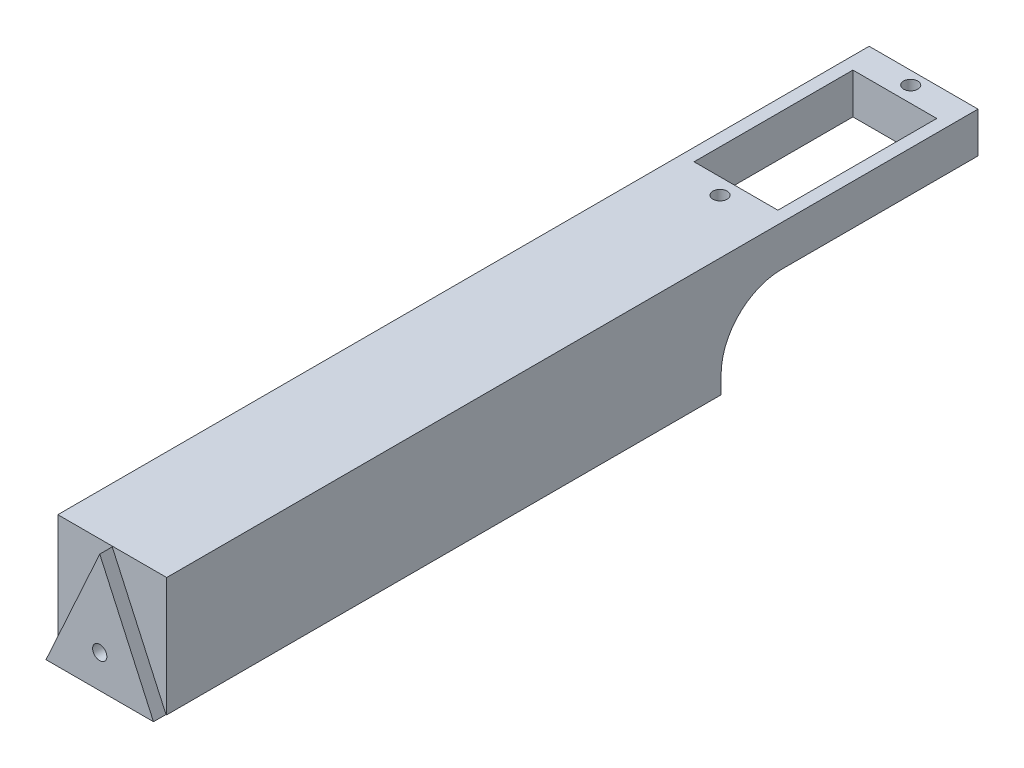
ISO-10303-21;
HEADER;
FILE_DESCRIPTION(('STEP AP214'),'2;1');
FILE_NAME('part.step','',(''),(''),'','','');
FILE_SCHEMA(('AUTOMOTIVE_DESIGN { 1 0 10303 214 1 1 1 1 }'));
ENDSEC;
DATA;
#1=APPLICATION_CONTEXT('core data for automotive mechanical design processes');
#2=APPLICATION_PROTOCOL_DEFINITION('international standard','automotive_design',2000,#1);
#3=PRODUCT_CONTEXT('',#1,'mechanical');
#4=PRODUCT('Part','Part','',(#3));
#5=PRODUCT_RELATED_PRODUCT_CATEGORY('part','',(#4));
#6=PRODUCT_DEFINITION_FORMATION('','',#4);
#7=PRODUCT_DEFINITION_CONTEXT('part definition',#1,'design');
#8=PRODUCT_DEFINITION('design','',#6,#7);
#9=PRODUCT_DEFINITION_SHAPE('','',#8);
#10=(LENGTH_UNIT() NAMED_UNIT(*) SI_UNIT(.MILLI.,.METRE.));
#11=(NAMED_UNIT(*) PLANE_ANGLE_UNIT() SI_UNIT($,.RADIAN.));
#12=(NAMED_UNIT(*) SI_UNIT($,.STERADIAN.) SOLID_ANGLE_UNIT());
#13=UNCERTAINTY_MEASURE_WITH_UNIT(LENGTH_MEASURE(1.E-05),#10,'distance_accuracy_value','');
#14=(GEOMETRIC_REPRESENTATION_CONTEXT(3) GLOBAL_UNCERTAINTY_ASSIGNED_CONTEXT((#13)) GLOBAL_UNIT_ASSIGNED_CONTEXT((#10,
#11,#12)) REPRESENTATION_CONTEXT('',''));
#15=CARTESIAN_POINT('',(0.,0.,0.));
#16=DIRECTION('',(0.,0.,1.));
#17=DIRECTION('',(1.,0.,0.));
#18=AXIS2_PLACEMENT_3D('',#15,#16,#17);
#19=CARTESIAN_POINT('',(-8.05,17.6,60.));
#20=DIRECTION('',(0.,0.,-1.));
#21=DIRECTION('',(-1.,0.,0.));
#22=AXIS2_PLACEMENT_3D('',#19,#20,#21);
#23=PLANE('',#22);
#24=DIRECTION('',(-0.413606946238924,0.910455542035366,0.));
#25=VECTOR('',#24,1.);
#26=CARTESIAN_POINT('',(7.95,0.,60.));
#27=LINE('',#26,#25);
#28=CARTESIAN_POINT('',(7.95,0.,60.));
#29=VERTEX_POINT('',#28);
#30=CARTESIAN_POINT('',(0.,17.5,60.));
#31=VERTEX_POINT('',#30);
#32=EDGE_CURVE('E450',#29,#31,#27,.T.);
#33=ORIENTED_EDGE('',*,*,#32,.F.);
#34=DIRECTION('',(1.,0.,0.));
#35=VECTOR('',#34,1.);
#36=CARTESIAN_POINT('',(-8.05,0.,60.));
#37=LINE('',#36,#35);
#38=CARTESIAN_POINT('',(8.05,0.,60.));
#39=VERTEX_POINT('',#38);
#40=EDGE_CURVE('E481',#29,#39,#37,.T.);
#41=ORIENTED_EDGE('',*,*,#40,.T.);
#42=DIRECTION('',(0.,-1.,0.));
#43=VECTOR('',#42,1.);
#44=CARTESIAN_POINT('',(8.05,17.6,60.));
#45=LINE('',#44,#43);
#46=CARTESIAN_POINT('',(8.05,17.6,60.));
#47=VERTEX_POINT('',#46);
#48=EDGE_CURVE('E173',#47,#39,#45,.T.);
#49=ORIENTED_EDGE('',*,*,#48,.F.);
#50=DIRECTION('',(1.,0.,0.));
#51=VECTOR('',#50,1.);
#52=CARTESIAN_POINT('',(-8.05,17.6,60.));
#53=LINE('',#52,#51);
#54=CARTESIAN_POINT('',(-8.05,17.6,60.));
#55=VERTEX_POINT('',#54);
#56=EDGE_CURVE('E397',#55,#47,#53,.T.);
#57=ORIENTED_EDGE('',*,*,#56,.F.);
#58=DIRECTION('',(0.,-1.,0.));
#59=VECTOR('',#58,1.);
#60=CARTESIAN_POINT('',(-8.05,17.6,60.));
#61=LINE('',#60,#59);
#62=CARTESIAN_POINT('',(-8.05,0.,60.));
#63=VERTEX_POINT('',#62);
#64=EDGE_CURVE('E170',#55,#63,#61,.T.);
#65=ORIENTED_EDGE('',*,*,#64,.T.);
#66=CARTESIAN_POINT('',(-7.95,0.,60.));
#67=VERTEX_POINT('',#66);
#68=EDGE_CURVE('E400',#63,#67,#37,.T.);
#69=ORIENTED_EDGE('',*,*,#68,.T.);
#70=DIRECTION('',(-0.413606946238923,-0.910455542035366,0.));
#71=VECTOR('',#70,1.);
#72=CARTESIAN_POINT('',(0.,17.5,60.));
#73=LINE('',#72,#71);
#74=EDGE_CURVE('E457',#31,#67,#73,.T.);
#75=ORIENTED_EDGE('',*,*,#74,.F.);
#76=EDGE_LOOP('',(#33,#41,#49,#57,#65,#69,#75));
#77=FACE_BOUND('',#76,.T.);
#78=ADVANCED_FACE('F44',(#77),#23,.F.);
#79=CARTESIAN_POINT('',(8.05,17.6,60.));
#80=DIRECTION('',(-1.,0.,0.));
#81=DIRECTION('',(0.,0.,1.));
#82=AXIS2_PLACEMENT_3D('',#79,#80,#81);
#83=PLANE('',#82);
#84=DIRECTION('',(0.,0.,-1.));
#85=VECTOR('',#84,1.);
#86=CARTESIAN_POINT('',(8.05,0.,60.));
#87=LINE('',#86,#85);
#88=CARTESIAN_POINT('',(8.05,0.,-22.));
#89=VERTEX_POINT('',#88);
#90=EDGE_CURVE('E473',#39,#89,#87,.T.);
#91=ORIENTED_EDGE('',*,*,#90,.T.);
#92=DIRECTION('',(0.,-1.,0.));
#93=VECTOR('',#92,1.);
#94=CARTESIAN_POINT('',(8.05,2.59999999999993,-22.));
#95=LINE('',#94,#93);
#96=CARTESIAN_POINT('',(8.05,2.59999999999994,-22.));
#97=VERTEX_POINT('',#96);
#98=EDGE_CURVE('E61',#97,#89,#95,.T.);
#99=ORIENTED_EDGE('',*,*,#98,.F.);
#100=CARTESIAN_POINT('',(8.05,2.6,-31.));
#101=DIRECTION('',(1.,0.,0.));
#102=DIRECTION('',(0.,0.,-1.));
#103=AXIS2_PLACEMENT_3D('',#100,#101,#102);
#104=CIRCLE('',#103,9.);
#105=CARTESIAN_POINT('',(8.05,11.6,-31.0000000000001));
#106=VERTEX_POINT('',#105);
#107=EDGE_CURVE('E406',#106,#97,#104,.T.);
#108=ORIENTED_EDGE('',*,*,#107,.F.);
#109=DIRECTION('',(0.,0.,1.));
#110=VECTOR('',#109,1.);
#111=CARTESIAN_POINT('',(8.05,11.6,-60.));
#112=LINE('',#111,#110);
#113=CARTESIAN_POINT('',(8.05,11.6,-60.));
#114=VERTEX_POINT('',#113);
#115=EDGE_CURVE('E404',#114,#106,#112,.T.);
#116=ORIENTED_EDGE('',*,*,#115,.F.);
#117=DIRECTION('',(0.,-1.,0.));
#118=VECTOR('',#117,1.);
#119=CARTESIAN_POINT('',(8.05,17.6,-60.));
#120=LINE('',#119,#118);
#121=CARTESIAN_POINT('',(8.05,17.6,-60.));
#122=VERTEX_POINT('',#121);
#123=EDGE_CURVE('E11',#122,#114,#120,.T.);
#124=ORIENTED_EDGE('',*,*,#123,.F.);
#125=DIRECTION('',(0.,0.,-1.));
#126=VECTOR('',#125,1.);
#127=CARTESIAN_POINT('',(8.05,17.6,60.));
#128=LINE('',#127,#126);
#129=EDGE_CURVE('E394',#47,#122,#128,.T.);
#130=ORIENTED_EDGE('',*,*,#129,.F.);
#131=ORIENTED_EDGE('',*,*,#48,.T.);
#132=EDGE_LOOP('',(#91,#99,#108,#116,#124,#130,#131));
#133=FACE_BOUND('',#132,.T.);
#134=ADVANCED_FACE('F46',(#133),#83,.F.);
#135=CARTESIAN_POINT('',(-8.05,17.6,-60.));
#136=DIRECTION('',(0.,0.,1.));
#137=DIRECTION('',(1.,0.,0.));
#138=AXIS2_PLACEMENT_3D('',#135,#136,#137);
#139=PLANE('',#138);
#140=ORIENTED_EDGE('',*,*,#123,.T.);
#141=DIRECTION('',(1.,0.,0.));
#142=VECTOR('',#141,1.);
#143=CARTESIAN_POINT('',(-8.05,11.6,-60.));
#144=LINE('',#143,#142);
#145=CARTESIAN_POINT('',(-8.05,11.6,-60.));
#146=VERTEX_POINT('',#145);
#147=EDGE_CURVE('E151',#146,#114,#144,.T.);
#148=ORIENTED_EDGE('',*,*,#147,.F.);
#149=DIRECTION('',(0.,-1.,0.));
#150=VECTOR('',#149,1.);
#151=CARTESIAN_POINT('',(-8.05,17.6,-60.));
#152=LINE('',#151,#150);
#153=CARTESIAN_POINT('',(-8.05,17.6,-60.));
#154=VERTEX_POINT('',#153);
#155=EDGE_CURVE('E53',#154,#146,#152,.T.);
#156=ORIENTED_EDGE('',*,*,#155,.F.);
#157=DIRECTION('',(-1.,0.,0.));
#158=VECTOR('',#157,1.);
#159=CARTESIAN_POINT('',(-8.05,17.6,-60.));
#160=LINE('',#159,#158);
#161=EDGE_CURVE('E395',#122,#154,#160,.T.);
#162=ORIENTED_EDGE('',*,*,#161,.F.);
#163=EDGE_LOOP('',(#140,#148,#156,#162));
#164=FACE_BOUND('',#163,.T.);
#165=ADVANCED_FACE('F162',(#164),#139,.F.);
#166=CARTESIAN_POINT('',(-8.05,17.6,60.));
#167=DIRECTION('',(1.,0.,0.));
#168=DIRECTION('',(0.,0.,-1.));
#169=AXIS2_PLACEMENT_3D('',#166,#167,#168);
#170=PLANE('',#169);
#171=CARTESIAN_POINT('',(-8.05,2.6,-31.));
#172=DIRECTION('',(1.,0.,0.));
#173=DIRECTION('',(0.,0.,-1.));
#174=AXIS2_PLACEMENT_3D('',#171,#172,#173);
#175=CIRCLE('',#174,9.);
#176=CARTESIAN_POINT('',(-8.05,11.6,-31.0000000000001));
#177=VERTEX_POINT('',#176);
#178=CARTESIAN_POINT('',(-8.05,2.59999999999994,-22.));
#179=VERTEX_POINT('',#178);
#180=EDGE_CURVE('E158',#177,#179,#175,.T.);
#181=ORIENTED_EDGE('',*,*,#180,.T.);
#182=DIRECTION('',(0.,-1.,0.));
#183=VECTOR('',#182,1.);
#184=CARTESIAN_POINT('',(-8.05,2.59999999999993,-22.));
#185=LINE('',#184,#183);
#186=CARTESIAN_POINT('',(-8.05,0.,-22.));
#187=VERTEX_POINT('',#186);
#188=EDGE_CURVE('E165',#179,#187,#185,.T.);
#189=ORIENTED_EDGE('',*,*,#188,.T.);
#190=DIRECTION('',(0.,0.,1.));
#191=VECTOR('',#190,1.);
#192=CARTESIAN_POINT('',(-8.05,0.,60.));
#193=LINE('',#192,#191);
#194=EDGE_CURVE('E479',#187,#63,#193,.T.);
#195=ORIENTED_EDGE('',*,*,#194,.T.);
#196=ORIENTED_EDGE('',*,*,#64,.F.);
#197=DIRECTION('',(0.,0.,1.));
#198=VECTOR('',#197,1.);
#199=CARTESIAN_POINT('',(-8.05,17.6,60.));
#200=LINE('',#199,#198);
#201=EDGE_CURVE('E169',#154,#55,#200,.T.);
#202=ORIENTED_EDGE('',*,*,#201,.F.);
#203=ORIENTED_EDGE('',*,*,#155,.T.);
#204=DIRECTION('',(0.,0.,1.));
#205=VECTOR('',#204,1.);
#206=CARTESIAN_POINT('',(-8.05,11.6,-60.));
#207=LINE('',#206,#205);
#208=EDGE_CURVE('E146',#146,#177,#207,.T.);
#209=ORIENTED_EDGE('',*,*,#208,.T.);
#210=EDGE_LOOP('',(#181,#189,#195,#196,#202,#203,#209));
#211=FACE_BOUND('',#210,.T.);
#212=ADVANCED_FACE('F167',(#211),#170,.F.);
#213=CARTESIAN_POINT('',(0.,17.6,0.));
#214=DIRECTION('',(0.,-1.,0.));
#215=DIRECTION('',(0.,0.,-1.));
#216=AXIS2_PLACEMENT_3D('',#213,#214,#215);
#217=PLANE('',#216);
#218=CARTESIAN_POINT('',(0.,17.6,-29.9));
#219=DIRECTION('',(0.,1.,0.));
#220=DIRECTION('',(0.,0.,1.));
#221=AXIS2_PLACEMENT_3D('',#218,#219,#220);
#222=CIRCLE('',#221,1.05);
#223=CARTESIAN_POINT('',(0.,17.6,-28.85));
#224=VERTEX_POINT('',#223);
#225=EDGE_CURVE('E381',#224,#224,#222,.T.);
#226=ORIENTED_EDGE('',*,*,#225,.F.);
#227=EDGE_LOOP('',(#226));
#228=FACE_BOUND('',#227,.T.);
#229=CARTESIAN_POINT('',(0.,17.6,-58.1));
#230=DIRECTION('',(0.,1.,0.));
#231=DIRECTION('',(0.,0.,1.));
#232=AXIS2_PLACEMENT_3D('',#229,#230,#231);
#233=CIRCLE('',#232,1.05);
#234=CARTESIAN_POINT('',(0.,17.6,-57.05));
#235=VERTEX_POINT('',#234);
#236=EDGE_CURVE('E385',#235,#235,#233,.T.);
#237=ORIENTED_EDGE('',*,*,#236,.F.);
#238=EDGE_LOOP('',(#237));
#239=FACE_BOUND('',#238,.T.);
#240=DIRECTION('',(-1.,0.,0.));
#241=VECTOR('',#240,1.);
#242=CARTESIAN_POINT('',(-6.2,17.6,-55.75));
#243=LINE('',#242,#241);
#244=CARTESIAN_POINT('',(6.2,17.6,-55.75));
#245=VERTEX_POINT('',#244);
#246=CARTESIAN_POINT('',(-6.2,17.6,-55.75));
#247=VERTEX_POINT('',#246);
#248=EDGE_CURVE('E391',#245,#247,#243,.T.);
#249=ORIENTED_EDGE('',*,*,#248,.F.);
#250=DIRECTION('',(0.,0.,-1.));
#251=VECTOR('',#250,1.);
#252=CARTESIAN_POINT('',(6.2,17.6,-32.25));
#253=LINE('',#252,#251);
#254=CARTESIAN_POINT('',(6.2,17.6,-32.25));
#255=VERTEX_POINT('',#254);
#256=EDGE_CURVE('E427',#255,#245,#253,.T.);
#257=ORIENTED_EDGE('',*,*,#256,.F.);
#258=DIRECTION('',(1.,0.,0.));
#259=VECTOR('',#258,1.);
#260=CARTESIAN_POINT('',(-6.2,17.6,-32.25));
#261=LINE('',#260,#259);
#262=CARTESIAN_POINT('',(-6.2,17.6,-32.25));
#263=VERTEX_POINT('',#262);
#264=EDGE_CURVE('E435',#263,#255,#261,.T.);
#265=ORIENTED_EDGE('',*,*,#264,.F.);
#266=DIRECTION('',(0.,0.,1.));
#267=VECTOR('',#266,1.);
#268=CARTESIAN_POINT('',(-6.2,17.6,-32.25));
#269=LINE('',#268,#267);
#270=EDGE_CURVE('E432',#247,#263,#269,.T.);
#271=ORIENTED_EDGE('',*,*,#270,.F.);
#272=EDGE_LOOP('',(#249,#257,#265,#271));
#273=FACE_BOUND('',#272,.T.);
#274=ORIENTED_EDGE('',*,*,#129,.T.);
#275=ORIENTED_EDGE('',*,*,#161,.T.);
#276=ORIENTED_EDGE('',*,*,#201,.T.);
#277=ORIENTED_EDGE('',*,*,#56,.T.);
#278=EDGE_LOOP('',(#274,#275,#276,#277));
#279=FACE_BOUND('',#278,.T.);
#280=ADVANCED_FACE('F223',(#228,#239,#273,#279),#217,.F.);
#281=CARTESIAN_POINT('',(0.,0.,0.));
#282=DIRECTION('',(0.,-1.,0.));
#283=DIRECTION('',(0.,0.,-1.));
#284=AXIS2_PLACEMENT_3D('',#281,#282,#283);
#285=PLANE('',#284);
#286=DIRECTION('',(1.,0.,0.));
#287=VECTOR('',#286,1.);
#288=CARTESIAN_POINT('',(-8.05,0.,-22.));
#289=LINE('',#288,#287);
#290=EDGE_CURVE('E183',#187,#89,#289,.T.);
#291=ORIENTED_EDGE('',*,*,#290,.T.);
#292=ORIENTED_EDGE('',*,*,#90,.F.);
#293=ORIENTED_EDGE('',*,*,#40,.F.);
#294=DIRECTION('',(0.,0.,-1.));
#295=VECTOR('',#294,1.);
#296=CARTESIAN_POINT('',(7.95,0.,61.85));
#297=LINE('',#296,#295);
#298=CARTESIAN_POINT('',(7.95,0.,61.85));
#299=VERTEX_POINT('',#298);
#300=EDGE_CURVE('E461',#299,#29,#297,.T.);
#301=ORIENTED_EDGE('',*,*,#300,.F.);
#302=DIRECTION('',(1.,0.,0.));
#303=VECTOR('',#302,1.);
#304=CARTESIAN_POINT('',(-7.95,0.,61.85));
#305=LINE('',#304,#303);
#306=CARTESIAN_POINT('',(-7.95,0.,61.85));
#307=VERTEX_POINT('',#306);
#308=EDGE_CURVE('E459',#307,#299,#305,.T.);
#309=ORIENTED_EDGE('',*,*,#308,.F.);
#310=DIRECTION('',(0.,0.,-1.));
#311=VECTOR('',#310,1.);
#312=CARTESIAN_POINT('',(-7.95,0.,61.85));
#313=LINE('',#312,#311);
#314=EDGE_CURVE('E468',#307,#67,#313,.T.);
#315=ORIENTED_EDGE('',*,*,#314,.T.);
#316=ORIENTED_EDGE('',*,*,#68,.F.);
#317=ORIENTED_EDGE('',*,*,#194,.F.);
#318=EDGE_LOOP('',(#291,#292,#293,#301,#309,#315,#316,#317));
#319=FACE_BOUND('',#318,.T.);
#320=ADVANCED_FACE('F220',(#319),#285,.T.);
#321=CARTESIAN_POINT('',(7.95,0.,61.85));
#322=DIRECTION('',(-0.910455542035366,-0.413606946238924,0.));
#323=DIRECTION('',(0.413606946238924,-0.910455542035366,0.));
#324=AXIS2_PLACEMENT_3D('',#321,#322,#323);
#325=PLANE('',#324);
#326=ORIENTED_EDGE('',*,*,#32,.T.);
#327=DIRECTION('',(0.,0.,-1.));
#328=VECTOR('',#327,1.);
#329=CARTESIAN_POINT('',(0.,17.5,61.85));
#330=LINE('',#329,#328);
#331=CARTESIAN_POINT('',(0.,17.5,61.85));
#332=VERTEX_POINT('',#331);
#333=EDGE_CURVE('E471',#332,#31,#330,.T.);
#334=ORIENTED_EDGE('',*,*,#333,.F.);
#335=DIRECTION('',(-0.413606946238924,0.910455542035366,0.));
#336=VECTOR('',#335,1.);
#337=CARTESIAN_POINT('',(7.95,0.,61.85));
#338=LINE('',#337,#336);
#339=EDGE_CURVE('E453',#299,#332,#338,.T.);
#340=ORIENTED_EDGE('',*,*,#339,.F.);
#341=ORIENTED_EDGE('',*,*,#300,.T.);
#342=EDGE_LOOP('',(#326,#334,#340,#341));
#343=FACE_BOUND('',#342,.T.);
#344=ADVANCED_FACE('F243',(#343),#325,.F.);
#345=CARTESIAN_POINT('',(0.,17.5,61.85));
#346=DIRECTION('',(0.910455542035366,-0.413606946238923,0.));
#347=DIRECTION('',(0.413606946238923,0.910455542035366,0.));
#348=AXIS2_PLACEMENT_3D('',#345,#346,#347);
#349=PLANE('',#348);
#350=ORIENTED_EDGE('',*,*,#74,.T.);
#351=ORIENTED_EDGE('',*,*,#314,.F.);
#352=DIRECTION('',(-0.413606946238923,-0.910455542035366,0.));
#353=VECTOR('',#352,1.);
#354=CARTESIAN_POINT('',(0.,17.5,61.85));
#355=LINE('',#354,#353);
#356=EDGE_CURVE('E456',#332,#307,#355,.T.);
#357=ORIENTED_EDGE('',*,*,#356,.F.);
#358=ORIENTED_EDGE('',*,*,#333,.T.);
#359=EDGE_LOOP('',(#350,#351,#357,#358));
#360=FACE_BOUND('',#359,.T.);
#361=ADVANCED_FACE('F336',(#360),#349,.F.);
#362=CARTESIAN_POINT('',(0.,0.,61.85));
#363=DIRECTION('',(0.,0.,-1.));
#364=DIRECTION('',(-1.,0.,0.));
#365=AXIS2_PLACEMENT_3D('',#362,#363,#364);
#366=PLANE('',#365);
#367=CARTESIAN_POINT('',(0.,4.89,61.85));
#368=DIRECTION('',(0.,0.,1.));
#369=DIRECTION('',(1.,0.,0.));
#370=AXIS2_PLACEMENT_3D('',#367,#368,#369);
#371=CIRCLE('',#370,1.05);
#372=CARTESIAN_POINT('',(1.05,4.89,61.85));
#373=VERTEX_POINT('',#372);
#374=EDGE_CURVE('E441',#373,#373,#371,.T.);
#375=ORIENTED_EDGE('',*,*,#374,.F.);
#376=EDGE_LOOP('',(#375));
#377=FACE_BOUND('',#376,.T.);
#378=ORIENTED_EDGE('',*,*,#339,.T.);
#379=ORIENTED_EDGE('',*,*,#356,.T.);
#380=ORIENTED_EDGE('',*,*,#308,.T.);
#381=EDGE_LOOP('',(#378,#379,#380));
#382=FACE_BOUND('',#381,.T.);
#383=ADVANCED_FACE('F327',(#377,#382),#366,.F.);
#384=CARTESIAN_POINT('',(0.,4.89,48.85));
#385=DIRECTION('',(0.,0.,1.));
#386=DIRECTION('',(1.,0.,0.));
#387=AXIS2_PLACEMENT_3D('',#384,#385,#386);
#388=CYLINDRICAL_SURFACE('',#387,1.05);
#389=CARTESIAN_POINT('',(0.,4.89,48.85));
#390=DIRECTION('',(0.,0.,1.));
#391=DIRECTION('',(1.,0.,0.));
#392=AXIS2_PLACEMENT_3D('',#389,#390,#391);
#393=CIRCLE('',#392,1.05);
#394=CARTESIAN_POINT('',(1.05,4.89,48.85));
#395=VERTEX_POINT('',#394);
#396=EDGE_CURVE('E447',#395,#395,#393,.T.);
#397=CARTESIAN_POINT('',(1.05,4.89,48.85));
#398=CARTESIAN_POINT('',(1.05,4.89,48.9854166666667));
#399=CARTESIAN_POINT('',(1.05,4.89,49.1208333333333));
#400=CARTESIAN_POINT('',(1.05,4.89,49.3916666666667));
#401=CARTESIAN_POINT('',(1.05,4.89,49.5270833333333));
#402=CARTESIAN_POINT('',(1.05,4.89,49.7979166666667));
#403=CARTESIAN_POINT('',(1.05,4.89,49.9333333333333));
#404=CARTESIAN_POINT('',(1.05,4.89,50.2041666666667));
#405=CARTESIAN_POINT('',(1.05,4.89,50.3395833333333));
#406=CARTESIAN_POINT('',(1.05,4.89,50.6104166666667));
#407=CARTESIAN_POINT('',(1.05,4.89,50.7458333333333));
#408=CARTESIAN_POINT('',(1.05,4.89,51.0166666666667));
#409=CARTESIAN_POINT('',(1.05,4.89,51.1520833333333));
#410=CARTESIAN_POINT('',(1.05,4.89,51.4229166666667));
#411=CARTESIAN_POINT('',(1.05,4.89,51.5583333333333));
#412=CARTESIAN_POINT('',(1.05,4.89,51.8291666666667));
#413=CARTESIAN_POINT('',(1.05,4.89,51.9645833333333));
#414=CARTESIAN_POINT('',(1.05,4.89,52.2354166666667));
#415=CARTESIAN_POINT('',(1.05,4.89,52.3708333333333));
#416=CARTESIAN_POINT('',(1.05,4.89,52.6416666666667));
#417=CARTESIAN_POINT('',(1.05,4.89,52.7770833333333));
#418=CARTESIAN_POINT('',(1.05,4.89,53.0479166666667));
#419=CARTESIAN_POINT('',(1.05,4.89,53.1833333333333));
#420=CARTESIAN_POINT('',(1.05,4.89,53.4541666666667));
#421=CARTESIAN_POINT('',(1.05,4.89,53.5895833333333));
#422=CARTESIAN_POINT('',(1.05,4.89,53.8604166666667));
#423=CARTESIAN_POINT('',(1.05,4.89,53.9958333333333));
#424=CARTESIAN_POINT('',(1.05,4.89,54.2666666666667));
#425=CARTESIAN_POINT('',(1.05,4.89,54.4020833333333));
#426=CARTESIAN_POINT('',(1.05,4.89,54.6729166666667));
#427=CARTESIAN_POINT('',(1.05,4.89,54.8083333333333));
#428=CARTESIAN_POINT('',(1.05,4.89,55.0791666666667));
#429=CARTESIAN_POINT('',(1.05,4.89,55.2145833333333));
#430=CARTESIAN_POINT('',(1.05,4.89,55.4854166666667));
#431=CARTESIAN_POINT('',(1.05,4.89,55.6208333333333));
#432=CARTESIAN_POINT('',(1.05,4.89,55.8916666666667));
#433=CARTESIAN_POINT('',(1.05,4.89,56.0270833333333));
#434=CARTESIAN_POINT('',(1.05,4.89,56.2979166666667));
#435=CARTESIAN_POINT('',(1.05,4.89,56.4333333333333));
#436=CARTESIAN_POINT('',(1.05,4.89,56.7041666666667));
#437=CARTESIAN_POINT('',(1.05,4.89,56.8395833333333));
#438=CARTESIAN_POINT('',(1.05,4.89,57.1104166666667));
#439=CARTESIAN_POINT('',(1.05,4.89,57.2458333333333));
#440=CARTESIAN_POINT('',(1.05,4.89,57.5166666666666));
#441=CARTESIAN_POINT('',(1.05,4.89,57.6520833333333));
#442=CARTESIAN_POINT('',(1.05,4.89,57.9229166666667));
#443=CARTESIAN_POINT('',(1.05,4.89,58.0583333333333));
#444=CARTESIAN_POINT('',(1.05,4.89,58.3291666666666));
#445=CARTESIAN_POINT('',(1.05,4.89,58.4645833333333));
#446=CARTESIAN_POINT('',(1.05,4.89,58.7354166666667));
#447=CARTESIAN_POINT('',(1.05,4.89,58.8708333333333));
#448=CARTESIAN_POINT('',(1.05,4.89,59.1416666666667));
#449=CARTESIAN_POINT('',(1.05,4.89,59.2770833333333));
#450=CARTESIAN_POINT('',(1.05,4.89,59.5479166666667));
#451=CARTESIAN_POINT('',(1.05,4.89,59.6833333333333));
#452=CARTESIAN_POINT('',(1.05,4.89,59.9541666666667));
#453=CARTESIAN_POINT('',(1.05,4.89,60.0895833333333));
#454=CARTESIAN_POINT('',(1.05,4.89,60.3604166666667));
#455=CARTESIAN_POINT('',(1.05,4.89,60.4958333333333));
#456=CARTESIAN_POINT('',(1.05,4.89,60.7666666666667));
#457=CARTESIAN_POINT('',(1.05,4.89,60.9020833333333));
#458=CARTESIAN_POINT('',(1.05,4.89,61.1729166666666));
#459=CARTESIAN_POINT('',(1.05,4.89,61.3083333333333));
#460=CARTESIAN_POINT('',(1.05,4.89,61.5791666666667));
#461=CARTESIAN_POINT('',(1.05,4.89,61.7145833333333));
#462=CARTESIAN_POINT('',(1.05,4.89,61.85));
#463=B_SPLINE_CURVE_WITH_KNOTS('',3,(#397,#398,#399,#400,#401,#402,#403,#404,#405,#406,#407,
#408,#409,#410,#411,#412,#413,#414,#415,#416,#417,#418,#419,#420,#421,#422,#423,#424,#425,#426,
#427,#428,#429,#430,#431,#432,#433,#434,#435,#436,#437,#438,#439,#440,#441,#442,#443,#444,#445,
#446,#447,#448,#449,#450,#451,#452,#453,#454,#455,#456,#457,#458,#459,#460,#461,#462),
.UNSPECIFIED.,.F.,.F.,(4,2,2,2,2,2,2,2,2,2,2,2,2,2,2,2,2,2,2,2,2,2,2,2,2,2,2,2,2,2,2,2,4),(0.,
0.406249999999997,0.812499999999994,1.21875,1.62499999999999,2.03125,2.4375,2.84374999999999,
3.25,3.65624999999999,4.0625,4.46874999999999,4.875,5.28124999999999,5.6875,6.09374999999999,
6.49999999999999,6.90625,7.31249999999999,7.71875,8.12499999999999,8.53124999999999,
8.93749999999999,9.34374999999999,9.74999999999999,10.15625,10.5625,10.96875,11.375,11.78125,
12.1875,12.59375,13.),.UNSPECIFIED.);
#464=EDGE_CURVE('BSEAM318',#395,#373,#463,.T.);
#465=ORIENTED_EDGE('',*,*,#396,.F.);
#466=ORIENTED_EDGE('',*,*,#374,.T.);
#467=ORIENTED_EDGE('',*,*,#464,.T.);
#468=ORIENTED_EDGE('',*,*,#464,.F.);
#469=EDGE_LOOP('',(#465,#467,#466,#468));
#470=FACE_BOUND('',#469,.T.);
#471=ADVANCED_FACE('F318',(#470),#388,.F.);
#472=CARTESIAN_POINT('',(0.,4.89,48.85));
#473=DIRECTION('',(0.,0.,1.));
#474=DIRECTION('',(1.,0.,0.));
#475=AXIS2_PLACEMENT_3D('',#472,#473,#474);
#476=PLANE('',#475);
#477=ORIENTED_EDGE('',*,*,#396,.T.);
#478=EDGE_LOOP('',(#477));
#479=FACE_BOUND('',#478,.T.);
#480=ADVANCED_FACE('F255',(#479),#476,.T.);
#481=CARTESIAN_POINT('',(6.2,0.,-32.25));
#482=DIRECTION('',(1.,0.,0.));
#483=DIRECTION('',(0.,0.,-1.));
#484=AXIS2_PLACEMENT_3D('',#481,#482,#483);
#485=PLANE('',#484);
#486=DIRECTION('',(0.,1.,0.));
#487=VECTOR('',#486,1.);
#488=CARTESIAN_POINT('',(6.2,0.,-55.75));
#489=LINE('',#488,#487);
#490=CARTESIAN_POINT('',(6.2,11.6,-55.75));
#491=VERTEX_POINT('',#490);
#492=EDGE_CURVE('E438',#491,#245,#489,.T.);
#493=ORIENTED_EDGE('',*,*,#492,.F.);
#494=DIRECTION('',(0.,0.,1.));
#495=VECTOR('',#494,1.);
#496=CARTESIAN_POINT('',(6.2,11.6,-32.25));
#497=LINE('',#496,#495);
#498=CARTESIAN_POINT('',(6.2,11.6,-32.25));
#499=VERTEX_POINT('',#498);
#500=EDGE_CURVE('E69',#491,#499,#497,.T.);
#501=ORIENTED_EDGE('',*,*,#500,.T.);
#502=DIRECTION('',(0.,1.,0.));
#503=VECTOR('',#502,1.);
#504=CARTESIAN_POINT('',(6.2,0.,-32.25));
#505=LINE('',#504,#503);
#506=EDGE_CURVE('E439',#499,#255,#505,.T.);
#507=ORIENTED_EDGE('',*,*,#506,.T.);
#508=ORIENTED_EDGE('',*,*,#256,.T.);
#509=EDGE_LOOP('',(#493,#501,#507,#508));
#510=FACE_BOUND('',#509,.T.);
#511=ADVANCED_FACE('F250',(#510),#485,.F.);
#512=CARTESIAN_POINT('',(-6.2,0.,-32.25));
#513=DIRECTION('',(0.,0.,1.));
#514=DIRECTION('',(1.,0.,0.));
#515=AXIS2_PLACEMENT_3D('',#512,#513,#514);
#516=PLANE('',#515);
#517=ORIENTED_EDGE('',*,*,#506,.F.);
#518=DIRECTION('',(-1.,0.,0.));
#519=VECTOR('',#518,1.);
#520=CARTESIAN_POINT('',(-6.2,11.6,-32.25));
#521=LINE('',#520,#519);
#522=CARTESIAN_POINT('',(-6.2,11.6,-32.25));
#523=VERTEX_POINT('',#522);
#524=EDGE_CURVE('E422',#499,#523,#521,.T.);
#525=ORIENTED_EDGE('',*,*,#524,.T.);
#526=DIRECTION('',(0.,1.,0.));
#527=VECTOR('',#526,1.);
#528=CARTESIAN_POINT('',(-6.2,0.,-32.25));
#529=LINE('',#528,#527);
#530=EDGE_CURVE('E442',#523,#263,#529,.T.);
#531=ORIENTED_EDGE('',*,*,#530,.T.);
#532=ORIENTED_EDGE('',*,*,#264,.T.);
#533=EDGE_LOOP('',(#517,#525,#531,#532));
#534=FACE_BOUND('',#533,.T.);
#535=ADVANCED_FACE('F254',(#534),#516,.F.);
#536=CARTESIAN_POINT('',(-6.2,0.,-32.25));
#537=DIRECTION('',(-1.,0.,0.));
#538=DIRECTION('',(0.,0.,1.));
#539=AXIS2_PLACEMENT_3D('',#536,#537,#538);
#540=PLANE('',#539);
#541=ORIENTED_EDGE('',*,*,#530,.F.);
#542=DIRECTION('',(0.,0.,-1.));
#543=VECTOR('',#542,1.);
#544=CARTESIAN_POINT('',(-6.2,11.6,-32.25));
#545=LINE('',#544,#543);
#546=CARTESIAN_POINT('',(-6.2,11.6,-55.75));
#547=VERTEX_POINT('',#546);
#548=EDGE_CURVE('E419',#523,#547,#545,.T.);
#549=ORIENTED_EDGE('',*,*,#548,.T.);
#550=DIRECTION('',(0.,1.,0.));
#551=VECTOR('',#550,1.);
#552=CARTESIAN_POINT('',(-6.2,0.,-55.75));
#553=LINE('',#552,#551);
#554=EDGE_CURVE('E444',#547,#247,#553,.T.);
#555=ORIENTED_EDGE('',*,*,#554,.T.);
#556=ORIENTED_EDGE('',*,*,#270,.T.);
#557=EDGE_LOOP('',(#541,#549,#555,#556));
#558=FACE_BOUND('',#557,.T.);
#559=ADVANCED_FACE('F205',(#558),#540,.F.);
#560=CARTESIAN_POINT('',(-6.2,0.,-55.75));
#561=DIRECTION('',(0.,0.,-1.));
#562=DIRECTION('',(-1.,0.,0.));
#563=AXIS2_PLACEMENT_3D('',#560,#561,#562);
#564=PLANE('',#563);
#565=ORIENTED_EDGE('',*,*,#554,.F.);
#566=DIRECTION('',(1.,0.,0.));
#567=VECTOR('',#566,1.);
#568=CARTESIAN_POINT('',(-6.2,11.6,-55.75));
#569=LINE('',#568,#567);
#570=EDGE_CURVE('E417',#547,#491,#569,.T.);
#571=ORIENTED_EDGE('',*,*,#570,.T.);
#572=ORIENTED_EDGE('',*,*,#492,.T.);
#573=ORIENTED_EDGE('',*,*,#248,.T.);
#574=EDGE_LOOP('',(#565,#571,#572,#573));
#575=FACE_BOUND('',#574,.T.);
#576=ADVANCED_FACE('F198',(#575),#564,.F.);
#577=CARTESIAN_POINT('',(0.,0.,-58.1));
#578=DIRECTION('',(0.,1.,0.));
#579=DIRECTION('',(0.,0.,1.));
#580=AXIS2_PLACEMENT_3D('',#577,#578,#579);
#581=CYLINDRICAL_SURFACE('',#580,1.05);
#582=CARTESIAN_POINT('',(0.,11.6,-58.1));
#583=DIRECTION('',(0.,1.,0.));
#584=DIRECTION('',(0.,0.,1.));
#585=AXIS2_PLACEMENT_3D('',#582,#583,#584);
#586=CIRCLE('',#585,1.05);
#587=CARTESIAN_POINT('',(0.,11.6,-57.05));
#588=VERTEX_POINT('',#587);
#589=EDGE_CURVE('E48',#588,#588,#586,.F.);
#590=ORIENTED_EDGE('',*,*,#589,.T.);
#591=EDGE_LOOP('',(#590));
#592=FACE_BOUND('',#591,.T.);
#593=ORIENTED_EDGE('',*,*,#236,.T.);
#594=EDGE_LOOP('',(#593));
#595=FACE_BOUND('',#594,.T.);
#596=ADVANCED_FACE('F196',(#592,#595),#581,.F.);
#597=CARTESIAN_POINT('',(0.,0.,-29.9));
#598=DIRECTION('',(0.,1.,0.));
#599=DIRECTION('',(0.,0.,1.));
#600=AXIS2_PLACEMENT_3D('',#597,#598,#599);
#601=CYLINDRICAL_SURFACE('',#600,1.05);
#602=CARTESIAN_POINT('',(0.,11.3394221776957,-28.85));
#603=CARTESIAN_POINT('',(-0.0578883077580839,11.3394233291537,-28.8500026403376));
#604=CARTESIAN_POINT('',(-0.115814088900629,11.3406086611025,-28.8548052553616));
#605=CARTESIAN_POINT('',(-0.230033419050633,11.3452650123566,-28.8738691996404));
#606=CARTESIAN_POINT('',(-0.286325138282873,11.3487384980419,-28.8881407354782));
#607=CARTESIAN_POINT('',(-0.395583711948646,11.3577091349764,-28.9256567755221));
#608=CARTESIAN_POINT('',(-0.448554571169172,11.3632037916276,-28.948890220348));
#609=CARTESIAN_POINT('',(-0.549814144470494,11.3758308379806,-29.0036087898354));
#610=CARTESIAN_POINT('',(-0.598103416952697,11.3829630320206,-29.0350929287232));
#611=CARTESIAN_POINT('',(-0.689503488877052,11.3985218792226,-29.1059708802438));
#612=CARTESIAN_POINT('',(-0.732519461381642,11.4069673558853,-29.1454827863892));
#613=CARTESIAN_POINT('',(-0.811366349512283,11.4245409159935,-29.230994609916));
#614=CARTESIAN_POINT('',(-0.847196190824538,11.4336691012232,-29.27699549564));
#615=CARTESIAN_POINT('',(-0.91148304915342,11.4522968229421,-29.3753769236595));
#616=CARTESIAN_POINT('',(-0.939752765203219,11.461800078143,-29.4278792820379));
#617=CARTESIAN_POINT('',(-0.98703357003842,11.4804600880717,-29.5369594051889));
#618=CARTESIAN_POINT('',(-1.00604429054228,11.4896168290035,-29.5935373319667));
#619=CARTESIAN_POINT('',(-1.03429948156015,11.5071877779771,-29.7094743796309));
#620=CARTESIAN_POINT('',(-1.04349941599003,11.5155984423424,-29.7688449165727));
#621=CARTESIAN_POINT('',(-1.05164505114826,11.5312963046455,-29.8884327588317));
#622=CARTESIAN_POINT('',(-1.05059147381442,11.5385835816429,-29.9486500042349));
#623=CARTESIAN_POINT('',(-1.03825902652422,11.5517542015806,-30.067461272488));
#624=CARTESIAN_POINT('',(-1.027100425728,11.5576530318218,-30.1260660539821));
#625=CARTESIAN_POINT('',(-0.99498504895028,11.568093616809,-30.2406528650525));
#626=CARTESIAN_POINT('',(-0.974028932356765,11.5726354628486,-30.2966350708534));
#627=CARTESIAN_POINT('',(-0.923197968552265,11.5803800643478,-30.4036596539452));
#628=CARTESIAN_POINT('',(-0.893433564073107,11.5835982871161,-30.4547534004135));
#629=CARTESIAN_POINT('',(-0.825728624495694,11.588936353142,-30.5512654093086));
#630=CARTESIAN_POINT('',(-0.787788238831416,11.5910562164722,-30.5966837754415));
#631=CARTESIAN_POINT('',(-0.704941144336811,11.5944208018867,-30.6803940906049));
#632=CARTESIAN_POINT('',(-0.660057021622307,11.5956682914054,-30.7187082893456));
#633=CARTESIAN_POINT('',(-0.564504741386032,11.5975517544823,-30.7872953708437));
#634=CARTESIAN_POINT('',(-0.513836529239446,11.5981877222647,-30.8175681776493));
#635=CARTESIAN_POINT('',(-0.408039139361634,11.5990878361344,-30.8692665438488));
#636=CARTESIAN_POINT('',(-0.352901009768419,11.5993512155699,-30.8906737973635));
#637=CARTESIAN_POINT('',(-0.239816219969324,11.5996941361717,-30.923944351461));
#638=CARTESIAN_POINT('',(-0.181869540193835,11.5997736760569,-30.9358075855321));
#639=CARTESIAN_POINT('',(-0.0647206098909688,11.5998619683602,-30.9496643767161));
#640=CARTESIAN_POINT('',(-0.00551663002748611,11.5998706159685,-30.9516433188311));
#641=CARTESIAN_POINT('',(0.112383684451068,11.5998362819969,-30.9456357357249));
#642=CARTESIAN_POINT('',(0.171080016836706,11.5997933001905,-30.9376491667605));
#643=CARTESIAN_POINT('',(0.286310452771071,11.5995782160918,-30.9119346833016));
#644=CARTESIAN_POINT('',(0.342844135443619,11.5994060887993,-30.8942048828758));
#645=CARTESIAN_POINT('',(0.452131535698235,11.5987692663636,-30.8495064337277));
#646=CARTESIAN_POINT('',(0.504885248538886,11.5983045708533,-30.8225377734168));
#647=CARTESIAN_POINT('',(0.605093889504711,11.5968571019352,-30.7601417585214));
#648=CARTESIAN_POINT('',(0.652550714953369,11.5958745147604,-30.7247174470792));
#649=CARTESIAN_POINT('',(0.740835072132758,11.5931369411802,-30.6464210090576));
#650=CARTESIAN_POINT('',(0.781662720717092,11.5913819683918,-30.6035490137873));
#651=CARTESIAN_POINT('',(0.855457461525945,11.5868600803154,-30.5116838634833));
#652=CARTESIAN_POINT('',(0.888439297167102,11.584095088204,-30.4627024573338));
#653=CARTESIAN_POINT('',(0.945716355665174,11.5773613136398,-30.3599768869331));
#654=CARTESIAN_POINT('',(0.970011799294481,11.5733925617863,-30.3062328437719));
#655=CARTESIAN_POINT('',(1.00922902338815,11.564153896835,-30.1956259548552));
#656=CARTESIAN_POINT('',(1.02416482224844,11.5588859461827,-30.1387679126595));
#657=CARTESIAN_POINT('',(1.04435361640148,11.547054616611,-30.0234909298753));
#658=CARTESIAN_POINT('',(1.04960639051063,11.5404912081042,-29.9650719536624));
#659=CARTESIAN_POINT('',(1.05035287355299,11.5261648107671,-29.8480117707247));
#660=CARTESIAN_POINT('',(1.04579547790471,11.5183957367651,-29.7893709965363));
#661=CARTESIAN_POINT('',(1.027014226128,11.5019424267912,-29.6737908657543));
#662=CARTESIAN_POINT('',(1.01278957322272,11.4932581154351,-29.6168516498072));
#663=CARTESIAN_POINT('',(0.974861423344844,11.4752247740036,-29.5054728297095));
#664=CARTESIAN_POINT('',(0.95103508254369,11.4658684731565,-29.4510762301955));
#665=CARTESIAN_POINT('',(0.894580935766153,11.4470692470942,-29.3470747227844));
#666=CARTESIAN_POINT('',(0.861952651622472,11.4376263171998,-29.29747007541));
#667=CARTESIAN_POINT('',(0.788412956710804,11.4190999442404,-29.2039562153096));
#668=CARTESIAN_POINT('',(0.747424990958388,11.4100208256169,-29.1601062885185));
#669=CARTESIAN_POINT('',(0.658451313545114,11.3928940622246,-29.0799219757855));
#670=CARTESIAN_POINT('',(0.610464276635982,11.3848466133422,-29.0435890163115));
#671=CARTESIAN_POINT('',(0.509249137743568,11.370403284375,-28.979829405872));
#672=CARTESIAN_POINT('',(0.456068506726584,11.3639940838834,-28.9523304231933));
#673=CARTESIAN_POINT('',(0.34567291568692,11.3532173287672,-28.9067392043439));
#674=CARTESIAN_POINT('',(0.288463287784725,11.3488471319907,-28.8886347912065));
#675=CARTESIAN_POINT('',(0.192408701316186,11.3436042599353,-28.8670546436976));
#676=CARTESIAN_POINT('',(0.154229811971152,11.342041156297,-28.8606693032425));
#677=CARTESIAN_POINT('',(0.0773728549171611,11.3399497427558,-28.8521411498549));
#678=CARTESIAN_POINT('',(0.038694799211646,11.3394214080164,-28.8499982350955));
#679=CARTESIAN_POINT('',(0.,11.3394221776957,-28.85));
#680=B_SPLINE_CURVE_WITH_KNOTS('',3,(#602,#603,#604,#605,#606,#607,#608,#609,#610,#611,#612,
#613,#614,#615,#616,#617,#618,#619,#620,#621,#622,#623,#624,#625,#626,#627,#628,#629,#630,#631,
#632,#633,#634,#635,#636,#637,#638,#639,#640,#641,#642,#643,#644,#645,#646,#647,#648,#649,#650,
#651,#652,#653,#654,#655,#656,#657,#658,#659,#660,#661,#662,#663,#664,#665,#666,#667,#668,#669,
#670,#671,#672,#673,#674,#675,#676,#677,#678,#679),.UNSPECIFIED.,.T.,.F.,(4,2,2,2,2,2,2,2,2,2,2,
2,2,2,2,2,2,2,2,2,2,2,2,2,2,2,2,2,2,2,2,2,2,2,2,2,2,2,4),(0.,0.173521531074872,0.34723040614677,
0.520725599293169,0.694200073084048,0.870440054446455,1.04670636376458,1.22700279106026,
1.40730638915795,1.58842503639916,1.76953093137991,1.94850924709374,2.12747551902341,
2.30428659295666,2.48109443555403,2.65733881401145,2.83358485705465,3.01019302565875,
3.18680242502245,3.36367288339586,3.5405441181365,3.71744960070799,3.8943553051776,
4.07119743799688,4.248036453252,4.42454048994422,4.60104004031013,4.7772746028877,
4.95351319103732,5.1306720881826,5.30784558856293,5.48736170274293,5.66688757113564,
5.84813791935936,6.02942263132755,6.2091827515444,6.38870928624601,6.50470061901394,
6.62068916771879),.UNSPECIFIED.);
#681=CARTESIAN_POINT('',(0.,11.3394221776957,-28.85));
#682=VERTEX_POINT('',#681);
#683=EDGE_CURVE('E176',#682,#682,#680,.T.);
#684=ORIENTED_EDGE('',*,*,#683,.T.);
#685=EDGE_LOOP('',(#684));
#686=FACE_BOUND('',#685,.T.);
#687=ORIENTED_EDGE('',*,*,#225,.T.);
#688=EDGE_LOOP('',(#687));
#689=FACE_BOUND('',#688,.T.);
#690=ADVANCED_FACE('F184',(#686,#689),#601,.F.);
#691=CARTESIAN_POINT('',(-8.05,11.6,-60.));
#692=DIRECTION('',(0.,1.,0.));
#693=DIRECTION('',(0.,0.,1.));
#694=AXIS2_PLACEMENT_3D('',#691,#692,#693);
#695=PLANE('',#694);
#696=ORIENTED_EDGE('',*,*,#115,.T.);
#697=DIRECTION('',(1.,0.,0.));
#698=VECTOR('',#697,1.);
#699=CARTESIAN_POINT('',(-8.05,11.6,-31.0000000000001));
#700=LINE('',#699,#698);
#701=EDGE_CURVE('E153',#177,#106,#700,.T.);
#702=ORIENTED_EDGE('',*,*,#701,.F.);
#703=ORIENTED_EDGE('',*,*,#208,.F.);
#704=ORIENTED_EDGE('',*,*,#147,.T.);
#705=EDGE_LOOP('',(#696,#702,#703,#704));
#706=FACE_BOUND('',#705,.T.);
#707=ORIENTED_EDGE('',*,*,#589,.F.);
#708=EDGE_LOOP('',(#707));
#709=FACE_BOUND('',#708,.T.);
#710=ORIENTED_EDGE('',*,*,#570,.F.);
#711=ORIENTED_EDGE('',*,*,#548,.F.);
#712=ORIENTED_EDGE('',*,*,#524,.F.);
#713=ORIENTED_EDGE('',*,*,#500,.F.);
#714=EDGE_LOOP('',(#710,#711,#712,#713));
#715=FACE_BOUND('',#714,.T.);
#716=ADVANCED_FACE('F149',(#706,#709,#715),#695,.F.);
#717=CARTESIAN_POINT('',(-8.05,2.6,-31.));
#718=DIRECTION('',(1.,0.,0.));
#719=DIRECTION('',(0.,0.,-1.));
#720=AXIS2_PLACEMENT_3D('',#717,#718,#719);
#721=CYLINDRICAL_SURFACE('',#720,9.);
#722=ORIENTED_EDGE('',*,*,#107,.T.);
#723=DIRECTION('',(1.,0.,0.));
#724=VECTOR('',#723,1.);
#725=CARTESIAN_POINT('',(-8.05,2.59999999999994,-22.));
#726=LINE('',#725,#724);
#727=EDGE_CURVE('E414',#179,#97,#726,.T.);
#728=ORIENTED_EDGE('',*,*,#727,.F.);
#729=ORIENTED_EDGE('',*,*,#180,.F.);
#730=ORIENTED_EDGE('',*,*,#701,.T.);
#731=EDGE_LOOP('',(#722,#728,#729,#730));
#732=FACE_BOUND('',#731,.T.);
#733=ORIENTED_EDGE('',*,*,#683,.F.);
#734=EDGE_LOOP('',(#733));
#735=FACE_BOUND('',#734,.T.);
#736=ADVANCED_FACE('F188',(#732,#735),#721,.F.);
#737=CARTESIAN_POINT('',(-8.05,2.59999999999993,-22.));
#738=DIRECTION('',(0.,0.,1.));
#739=DIRECTION('',(1.,0.,0.));
#740=AXIS2_PLACEMENT_3D('',#737,#738,#739);
#741=PLANE('',#740);
#742=ORIENTED_EDGE('',*,*,#98,.T.);
#743=ORIENTED_EDGE('',*,*,#290,.F.);
#744=ORIENTED_EDGE('',*,*,#188,.F.);
#745=ORIENTED_EDGE('',*,*,#727,.T.);
#746=EDGE_LOOP('',(#742,#743,#744,#745));
#747=FACE_BOUND('',#746,.T.);
#748=ADVANCED_FACE('F193',(#747),#741,.F.);
#749=CLOSED_SHELL('',(#78,#134,#165,#212,#280,#320,#344,#361,#383,#471,#480,#511,#535,#559,#576,
#596,#690,#716,#736,#748));
#750=MANIFOLD_SOLID_BREP('B2',#749);
#751=ADVANCED_BREP_SHAPE_REPRESENTATION('',(#18,#750),#14);
#752=SHAPE_DEFINITION_REPRESENTATION(#9,#751);
ENDSEC;
END-ISO-10303-21;
